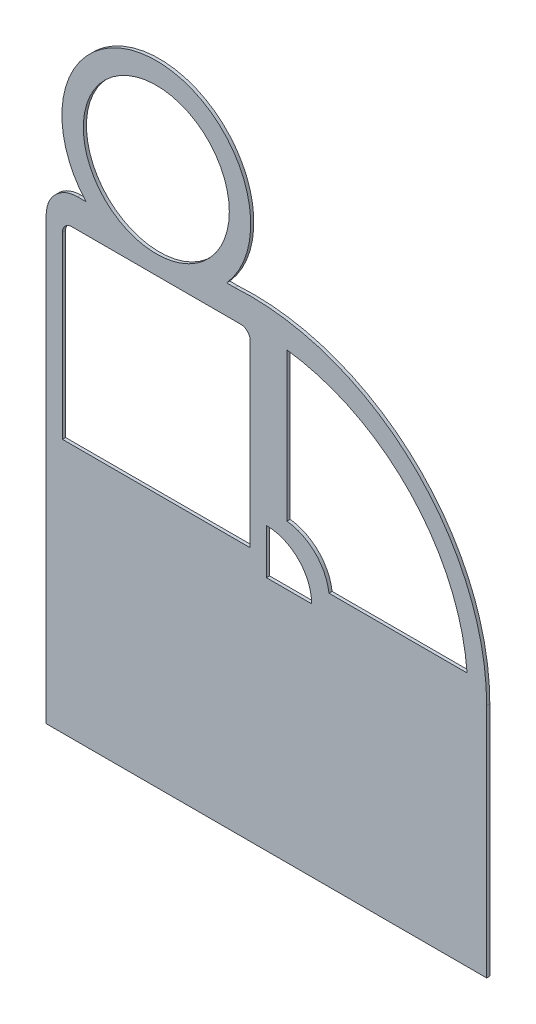
ISO-10303-21;
HEADER;
FILE_DESCRIPTION(('STEP AP214'),'2;1');
FILE_NAME('part.step','',(''),(''),'','','');
FILE_SCHEMA(('AUTOMOTIVE_DESIGN { 1 0 10303 214 1 1 1 1 }'));
ENDSEC;
DATA;
#1=APPLICATION_CONTEXT('core data for automotive mechanical design processes');
#2=APPLICATION_PROTOCOL_DEFINITION('international standard','automotive_design',2000,#1);
#3=PRODUCT_CONTEXT('',#1,'mechanical');
#4=PRODUCT('Part','Part','',(#3));
#5=PRODUCT_RELATED_PRODUCT_CATEGORY('part','',(#4));
#6=PRODUCT_DEFINITION_FORMATION('','',#4);
#7=PRODUCT_DEFINITION_CONTEXT('part definition',#1,'design');
#8=PRODUCT_DEFINITION('design','',#6,#7);
#9=PRODUCT_DEFINITION_SHAPE('','',#8);
#10=(LENGTH_UNIT() NAMED_UNIT(*) SI_UNIT(.MILLI.,.METRE.));
#11=(NAMED_UNIT(*) PLANE_ANGLE_UNIT() SI_UNIT($,.RADIAN.));
#12=(NAMED_UNIT(*) SI_UNIT($,.STERADIAN.) SOLID_ANGLE_UNIT());
#13=UNCERTAINTY_MEASURE_WITH_UNIT(LENGTH_MEASURE(1.E-05),#10,'distance_accuracy_value','');
#14=(GEOMETRIC_REPRESENTATION_CONTEXT(3) GLOBAL_UNCERTAINTY_ASSIGNED_CONTEXT((#13)) GLOBAL_UNIT_ASSIGNED_CONTEXT((#10,
#11,#12)) REPRESENTATION_CONTEXT('',''));
#15=CARTESIAN_POINT('',(0.,0.,0.));
#16=DIRECTION('',(0.,0.,1.));
#17=DIRECTION('',(1.,0.,0.));
#18=AXIS2_PLACEMENT_3D('',#15,#16,#17);
#19=CARTESIAN_POINT('',(0.,-603.714224790879,-10.));
#20=DIRECTION('',(0.,-1.,0.));
#21=DIRECTION('',(0.,0.,-1.));
#22=AXIS2_PLACEMENT_3D('',#19,#20,#21);
#23=PLANE('',#22);
#24=DIRECTION('',(1.,0.,0.));
#25=VECTOR('',#24,1.);
#26=CARTESIAN_POINT('',(0.,-603.714224790879,0.));
#27=LINE('',#26,#25);
#28=CARTESIAN_POINT('',(328.257173598163,-603.714224790879,0.));
#29=VERTEX_POINT('',#28);
#30=CARTESIAN_POINT('',(864.880365348647,-603.714224790879,0.));
#31=VERTEX_POINT('',#30);
#32=EDGE_CURVE('E298',#29,#31,#27,.T.);
#33=ORIENTED_EDGE('',*,*,#32,.F.);
#34=DIRECTION('',(0.,0.,1.));
#35=VECTOR('',#34,1.);
#36=CARTESIAN_POINT('',(328.257173598163,-603.714224790879,-10.));
#37=LINE('',#36,#35);
#38=CARTESIAN_POINT('',(328.257173598163,-603.714224790879,-10.));
#39=VERTEX_POINT('',#38);
#40=EDGE_CURVE('E11',#39,#29,#37,.T.);
#41=ORIENTED_EDGE('',*,*,#40,.F.);
#42=DIRECTION('',(1.,0.,0.));
#43=VECTOR('',#42,1.);
#44=CARTESIAN_POINT('',(0.,-603.714224790879,-10.));
#45=LINE('',#44,#43);
#46=CARTESIAN_POINT('',(864.880365348647,-603.714224790879,-10.));
#47=VERTEX_POINT('',#46);
#48=EDGE_CURVE('E353',#39,#47,#45,.T.);
#49=ORIENTED_EDGE('',*,*,#48,.T.);
#50=DIRECTION('',(0.,0.,1.));
#51=VECTOR('',#50,1.);
#52=CARTESIAN_POINT('',(864.880365348647,-603.714224790879,-10.));
#53=LINE('',#52,#51);
#54=EDGE_CURVE('E214',#47,#31,#53,.T.);
#55=ORIENTED_EDGE('',*,*,#54,.T.);
#56=EDGE_LOOP('',(#33,#41,#49,#55));
#57=FACE_BOUND('',#56,.T.);
#58=ADVANCED_FACE('F35',(#57),#23,.T.);
#59=CARTESIAN_POINT('',(328.257173598163,-633.714224790879,-10.));
#60=DIRECTION('',(0.,0.,1.));
#61=DIRECTION('',(1.,0.,0.));
#62=AXIS2_PLACEMENT_3D('',#59,#60,#61);
#63=CYLINDRICAL_SURFACE('',#62,30.);
#64=CARTESIAN_POINT('',(328.257173598163,-633.714224790879,0.));
#65=DIRECTION('',(0.,0.,1.));
#66=DIRECTION('',(1.,0.,0.));
#67=AXIS2_PLACEMENT_3D('',#64,#65,#66);
#68=CIRCLE('',#67,30.);
#69=CARTESIAN_POINT('',(298.257173598163,-633.714224790879,0.));
#70=VERTEX_POINT('',#69);
#71=EDGE_CURVE('E310',#29,#70,#68,.T.);
#72=ORIENTED_EDGE('',*,*,#71,.T.);
#73=DIRECTION('',(0.,0.,1.));
#74=VECTOR('',#73,1.);
#75=CARTESIAN_POINT('',(298.257173598163,-633.714224790879,-10.));
#76=LINE('',#75,#74);
#77=CARTESIAN_POINT('',(298.257173598163,-633.714224790879,-10.));
#78=VERTEX_POINT('',#77);
#79=EDGE_CURVE('E45',#78,#70,#76,.T.);
#80=ORIENTED_EDGE('',*,*,#79,.F.);
#81=CARTESIAN_POINT('',(328.257173598163,-633.714224790879,-10.));
#82=DIRECTION('',(0.,0.,1.));
#83=DIRECTION('',(1.,0.,0.));
#84=AXIS2_PLACEMENT_3D('',#81,#82,#83);
#85=CIRCLE('',#84,30.);
#86=EDGE_CURVE('E203',#39,#78,#85,.T.);
#87=ORIENTED_EDGE('',*,*,#86,.F.);
#88=ORIENTED_EDGE('',*,*,#40,.T.);
#89=EDGE_LOOP('',(#72,#80,#87,#88));
#90=FACE_BOUND('',#89,.T.);
#91=ADVANCED_FACE('F376',(#90),#63,.F.);
#92=CARTESIAN_POINT('',(298.257173598162,0.,-10.));
#93=DIRECTION('',(-1.,0.,0.));
#94=DIRECTION('',(0.,-1.,0.));
#95=AXIS2_PLACEMENT_3D('',#92,#93,#94);
#96=PLANE('',#95);
#97=DIRECTION('',(0.,-1.,0.));
#98=VECTOR('',#97,1.);
#99=CARTESIAN_POINT('',(298.257173598162,0.,0.));
#100=LINE('',#99,#98);
#101=CARTESIAN_POINT('',(298.257173598163,-1203.71422479088,0.));
#102=VERTEX_POINT('',#101);
#103=EDGE_CURVE('E120',#70,#102,#100,.T.);
#104=ORIENTED_EDGE('',*,*,#103,.T.);
#105=DIRECTION('',(0.,0.,1.));
#106=VECTOR('',#105,1.);
#107=CARTESIAN_POINT('',(298.257173598163,-1203.71422479088,-10.));
#108=LINE('',#107,#106);
#109=CARTESIAN_POINT('',(298.257173598163,-1203.71422479088,-10.));
#110=VERTEX_POINT('',#109);
#111=EDGE_CURVE('E192',#110,#102,#108,.T.);
#112=ORIENTED_EDGE('',*,*,#111,.F.);
#113=DIRECTION('',(0.,-1.,0.));
#114=VECTOR('',#113,1.);
#115=CARTESIAN_POINT('',(298.257173598162,0.,-10.));
#116=LINE('',#115,#114);
#117=EDGE_CURVE('E197',#78,#110,#116,.T.);
#118=ORIENTED_EDGE('',*,*,#117,.F.);
#119=ORIENTED_EDGE('',*,*,#79,.T.);
#120=EDGE_LOOP('',(#104,#112,#118,#119));
#121=FACE_BOUND('',#120,.T.);
#122=ADVANCED_FACE('F207',(#121),#96,.F.);
#123=CARTESIAN_POINT('',(0.,-1203.71422479088,-10.));
#124=DIRECTION('',(0.,-1.,0.));
#125=DIRECTION('',(0.,0.,-1.));
#126=AXIS2_PLACEMENT_3D('',#123,#124,#125);
#127=PLANE('',#126);
#128=DIRECTION('',(1.,0.,0.));
#129=VECTOR('',#128,1.);
#130=CARTESIAN_POINT('',(0.,-1203.71422479088,0.));
#131=LINE('',#130,#129);
#132=CARTESIAN_POINT('',(894.880365348647,-1203.71422479088,0.));
#133=VERTEX_POINT('',#132);
#134=EDGE_CURVE('E307',#102,#133,#131,.T.);
#135=ORIENTED_EDGE('',*,*,#134,.T.);
#136=DIRECTION('',(0.,0.,1.));
#137=VECTOR('',#136,1.);
#138=CARTESIAN_POINT('',(894.880365348647,-1203.71422479088,-10.));
#139=LINE('',#138,#137);
#140=CARTESIAN_POINT('',(894.880365348647,-1203.71422479088,-10.));
#141=VERTEX_POINT('',#140);
#142=EDGE_CURVE('E193',#141,#133,#139,.T.);
#143=ORIENTED_EDGE('',*,*,#142,.F.);
#144=DIRECTION('',(1.,0.,0.));
#145=VECTOR('',#144,1.);
#146=CARTESIAN_POINT('',(0.,-1203.71422479088,-10.));
#147=LINE('',#146,#145);
#148=EDGE_CURVE('E187',#110,#141,#147,.T.);
#149=ORIENTED_EDGE('',*,*,#148,.F.);
#150=ORIENTED_EDGE('',*,*,#111,.T.);
#151=EDGE_LOOP('',(#135,#143,#149,#150));
#152=FACE_BOUND('',#151,.T.);
#153=ADVANCED_FACE('F190',(#152),#127,.F.);
#154=CARTESIAN_POINT('',(894.880365348646,3.48602381015803E-13,-10.));
#155=DIRECTION('',(-1.,0.,0.));
#156=DIRECTION('',(0.,-1.,0.));
#157=AXIS2_PLACEMENT_3D('',#154,#155,#156);
#158=PLANE('',#157);
#159=DIRECTION('',(0.,-1.,0.));
#160=VECTOR('',#159,1.);
#161=CARTESIAN_POINT('',(894.880365348646,3.48602381015803E-13,0.));
#162=LINE('',#161,#160);
#163=CARTESIAN_POINT('',(894.880365348647,-633.714224790879,0.));
#164=VERTEX_POINT('',#163);
#165=EDGE_CURVE('E304',#164,#133,#162,.T.);
#166=ORIENTED_EDGE('',*,*,#165,.F.);
#167=DIRECTION('',(0.,0.,1.));
#168=VECTOR('',#167,1.);
#169=CARTESIAN_POINT('',(894.880365348647,-633.714224790879,-10.));
#170=LINE('',#169,#168);
#171=CARTESIAN_POINT('',(894.880365348647,-633.714224790879,-10.));
#172=VERTEX_POINT('',#171);
#173=EDGE_CURVE('E210',#172,#164,#170,.T.);
#174=ORIENTED_EDGE('',*,*,#173,.F.);
#175=DIRECTION('',(0.,-1.,0.));
#176=VECTOR('',#175,1.);
#177=CARTESIAN_POINT('',(894.880365348646,3.48602381015803E-13,-10.));
#178=LINE('',#177,#176);
#179=EDGE_CURVE('E198',#172,#141,#178,.T.);
#180=ORIENTED_EDGE('',*,*,#179,.T.);
#181=ORIENTED_EDGE('',*,*,#142,.T.);
#182=EDGE_LOOP('',(#166,#174,#180,#181));
#183=FACE_BOUND('',#182,.T.);
#184=ADVANCED_FACE('F360',(#183),#158,.T.);
#185=CARTESIAN_POINT('',(894.880365348647,-1262.2429395449,-10.));
#186=DIRECTION('',(0.,0.,1.));
#187=DIRECTION('',(1.,0.,0.));
#188=AXIS2_PLACEMENT_3D('',#185,#186,#187);
#189=CYLINDRICAL_SURFACE('',#188,751.688404124758);
#190=CARTESIAN_POINT('',(894.880365348647,-1262.2429395449,0.));
#191=DIRECTION('',(0.,0.,1.));
#192=DIRECTION('',(1.,0.,0.));
#193=AXIS2_PLACEMENT_3D('',#190,#191,#192);
#194=CIRCLE('',#193,751.688404124758);
#195=CARTESIAN_POINT('',(846.568769473404,-512.108653833588,0.));
#196=VERTEX_POINT('',#195);
#197=CARTESIAN_POINT('',(1646.56876947341,-1262.2429395449,0.));
#198=VERTEX_POINT('',#197);
#199=EDGE_CURVE('E275',#196,#198,#194,.F.);
#200=ORIENTED_EDGE('',*,*,#199,.T.);
#201=DIRECTION('',(0.,0.,1.));
#202=VECTOR('',#201,1.);
#203=CARTESIAN_POINT('',(1646.56876947341,-1262.2429395449,-10.));
#204=LINE('',#203,#202);
#205=CARTESIAN_POINT('',(1646.56876947341,-1262.2429395449,-10.));
#206=VERTEX_POINT('',#205);
#207=EDGE_CURVE('E216',#206,#198,#204,.T.);
#208=ORIENTED_EDGE('',*,*,#207,.F.);
#209=CARTESIAN_POINT('',(894.880365348647,-1262.2429395449,-10.));
#210=DIRECTION('',(0.,0.,1.));
#211=DIRECTION('',(1.,0.,0.));
#212=AXIS2_PLACEMENT_3D('',#209,#210,#211);
#213=CIRCLE('',#212,751.688404124758);
#214=CARTESIAN_POINT('',(846.568769473404,-512.108653833588,-10.));
#215=VERTEX_POINT('',#214);
#216=EDGE_CURVE('E332',#215,#206,#213,.F.);
#217=ORIENTED_EDGE('',*,*,#216,.F.);
#218=DIRECTION('',(0.,0.,1.));
#219=VECTOR('',#218,1.);
#220=CARTESIAN_POINT('',(846.568769473404,-512.108653833588,-10.));
#221=LINE('',#220,#219);
#222=EDGE_CURVE('E230',#215,#196,#221,.T.);
#223=ORIENTED_EDGE('',*,*,#222,.T.);
#224=EDGE_LOOP('',(#200,#208,#217,#223));
#225=FACE_BOUND('',#224,.T.);
#226=ADVANCED_FACE('F388',(#225),#189,.T.);
#227=CARTESIAN_POINT('',(1646.56876947341,0.,-10.));
#228=DIRECTION('',(1.,0.,0.));
#229=DIRECTION('',(0.,0.,-1.));
#230=AXIS2_PLACEMENT_3D('',#227,#228,#229);
#231=PLANE('',#230);
#232=DIRECTION('',(0.,1.,0.));
#233=VECTOR('',#232,1.);
#234=CARTESIAN_POINT('',(1646.56876947341,0.,0.));
#235=LINE('',#234,#233);
#236=CARTESIAN_POINT('',(1646.56876947341,-2012.2429395449,0.));
#237=VERTEX_POINT('',#236);
#238=EDGE_CURVE('E295',#237,#198,#235,.T.);
#239=ORIENTED_EDGE('',*,*,#238,.F.);
#240=DIRECTION('',(0.,0.,1.));
#241=VECTOR('',#240,1.);
#242=CARTESIAN_POINT('',(1646.56876947341,-2012.2429395449,-10.));
#243=LINE('',#242,#241);
#244=CARTESIAN_POINT('',(1646.56876947341,-2012.2429395449,-10.));
#245=VERTEX_POINT('',#244);
#246=EDGE_CURVE('E218',#245,#237,#243,.T.);
#247=ORIENTED_EDGE('',*,*,#246,.F.);
#248=DIRECTION('',(0.,1.,0.));
#249=VECTOR('',#248,1.);
#250=CARTESIAN_POINT('',(1646.56876947341,0.,-10.));
#251=LINE('',#250,#249);
#252=EDGE_CURVE('E350',#245,#206,#251,.T.);
#253=ORIENTED_EDGE('',*,*,#252,.T.);
#254=ORIENTED_EDGE('',*,*,#207,.T.);
#255=EDGE_LOOP('',(#239,#247,#253,#254));
#256=FACE_BOUND('',#255,.T.);
#257=ADVANCED_FACE('F384',(#256),#231,.T.);
#258=CARTESIAN_POINT('',(0.,-2012.2429395449,-10.));
#259=DIRECTION('',(0.,-1.,0.));
#260=DIRECTION('',(0.,0.,-1.));
#261=AXIS2_PLACEMENT_3D('',#258,#259,#260);
#262=PLANE('',#261);
#263=DIRECTION('',(1.,0.,0.));
#264=VECTOR('',#263,1.);
#265=CARTESIAN_POINT('',(0.,-2012.2429395449,0.));
#266=LINE('',#265,#264);
#267=CARTESIAN_POINT('',(246.568769473405,-2012.2429395449,0.));
#268=VERTEX_POINT('',#267);
#269=EDGE_CURVE('E292',#268,#237,#266,.T.);
#270=ORIENTED_EDGE('',*,*,#269,.F.);
#271=DIRECTION('',(0.,0.,1.));
#272=VECTOR('',#271,1.);
#273=CARTESIAN_POINT('',(246.568769473405,-2012.2429395449,-10.));
#274=LINE('',#273,#272);
#275=CARTESIAN_POINT('',(246.568769473405,-2012.2429395449,-10.));
#276=VERTEX_POINT('',#275);
#277=EDGE_CURVE('E220',#276,#268,#274,.T.);
#278=ORIENTED_EDGE('',*,*,#277,.F.);
#279=DIRECTION('',(1.,0.,0.));
#280=VECTOR('',#279,1.);
#281=CARTESIAN_POINT('',(0.,-2012.2429395449,-10.));
#282=LINE('',#281,#280);
#283=EDGE_CURVE('E347',#276,#245,#282,.T.);
#284=ORIENTED_EDGE('',*,*,#283,.T.);
#285=ORIENTED_EDGE('',*,*,#246,.T.);
#286=EDGE_LOOP('',(#270,#278,#284,#285));
#287=FACE_BOUND('',#286,.T.);
#288=ADVANCED_FACE('F387',(#287),#262,.T.);
#289=CARTESIAN_POINT('',(246.568769473405,0.,-10.));
#290=DIRECTION('',(-1.,0.,0.));
#291=DIRECTION('',(0.,-1.,0.));
#292=AXIS2_PLACEMENT_3D('',#289,#290,#291);
#293=PLANE('',#292);
#294=DIRECTION('',(0.,-1.,0.));
#295=VECTOR('',#294,1.);
#296=CARTESIAN_POINT('',(246.568769473405,0.,0.));
#297=LINE('',#296,#295);
#298=CARTESIAN_POINT('',(246.568769473405,-612.108653833588,0.));
#299=VERTEX_POINT('',#298);
#300=EDGE_CURVE('E289',#299,#268,#297,.T.);
#301=ORIENTED_EDGE('',*,*,#300,.F.);
#302=DIRECTION('',(0.,0.,1.));
#303=VECTOR('',#302,1.);
#304=CARTESIAN_POINT('',(246.568769473405,-612.108653833588,-10.));
#305=LINE('',#304,#303);
#306=CARTESIAN_POINT('',(246.568769473405,-612.108653833588,-10.));
#307=VERTEX_POINT('',#306);
#308=EDGE_CURVE('E222',#307,#299,#305,.T.);
#309=ORIENTED_EDGE('',*,*,#308,.F.);
#310=DIRECTION('',(0.,-1.,0.));
#311=VECTOR('',#310,1.);
#312=CARTESIAN_POINT('',(246.568769473405,0.,-10.));
#313=LINE('',#312,#311);
#314=EDGE_CURVE('E344',#307,#276,#313,.T.);
#315=ORIENTED_EDGE('',*,*,#314,.T.);
#316=ORIENTED_EDGE('',*,*,#277,.T.);
#317=EDGE_LOOP('',(#301,#309,#315,#316));
#318=FACE_BOUND('',#317,.T.);
#319=ADVANCED_FACE('F392',(#318),#293,.T.);
#320=CARTESIAN_POINT('',(346.568769473405,-612.108653833588,-10.));
#321=DIRECTION('',(0.,0.,1.));
#322=DIRECTION('',(1.,0.,0.));
#323=AXIS2_PLACEMENT_3D('',#320,#321,#322);
#324=CYLINDRICAL_SURFACE('',#323,100.);
#325=CARTESIAN_POINT('',(346.568769473405,-612.108653833588,0.));
#326=DIRECTION('',(0.,0.,1.));
#327=DIRECTION('',(1.,0.,0.));
#328=AXIS2_PLACEMENT_3D('',#325,#326,#327);
#329=CIRCLE('',#328,100.);
#330=CARTESIAN_POINT('',(346.568769473405,-512.108653833588,0.));
#331=VERTEX_POINT('',#330);
#332=EDGE_CURVE('E286',#331,#299,#329,.T.);
#333=ORIENTED_EDGE('',*,*,#332,.F.);
#334=DIRECTION('',(0.,0.,1.));
#335=VECTOR('',#334,1.);
#336=CARTESIAN_POINT('',(346.568769473405,-512.108653833588,-10.));
#337=LINE('',#336,#335);
#338=CARTESIAN_POINT('',(346.568769473405,-512.108653833588,-10.));
#339=VERTEX_POINT('',#338);
#340=EDGE_CURVE('E224',#339,#331,#337,.T.);
#341=ORIENTED_EDGE('',*,*,#340,.F.);
#342=CARTESIAN_POINT('',(346.568769473405,-612.108653833588,-10.));
#343=DIRECTION('',(0.,0.,1.));
#344=DIRECTION('',(1.,0.,0.));
#345=AXIS2_PLACEMENT_3D('',#342,#343,#344);
#346=CIRCLE('',#345,100.);
#347=EDGE_CURVE('E341',#339,#307,#346,.T.);
#348=ORIENTED_EDGE('',*,*,#347,.T.);
#349=ORIENTED_EDGE('',*,*,#308,.T.);
#350=EDGE_LOOP('',(#333,#341,#348,#349));
#351=FACE_BOUND('',#350,.T.);
#352=ADVANCED_FACE('F396',(#351),#324,.T.);
#353=CARTESIAN_POINT('',(-4.3083428316879E-12,-512.108653833585,-10.));
#354=DIRECTION('',(0.,-1.,0.));
#355=DIRECTION('',(1.,0.,0.));
#356=AXIS2_PLACEMENT_3D('',#353,#354,#355);
#357=PLANE('',#356);
#358=DIRECTION('',(1.,0.,0.));
#359=VECTOR('',#358,1.);
#360=CARTESIAN_POINT('',(-4.3083428316879E-12,-512.108653833585,0.));
#361=LINE('',#360,#359);
#362=CARTESIAN_POINT('',(372.961971723426,-512.108653833588,0.));
#363=VERTEX_POINT('',#362);
#364=EDGE_CURVE('E283',#331,#363,#361,.T.);
#365=ORIENTED_EDGE('',*,*,#364,.T.);
#366=DIRECTION('',(0.,0.,1.));
#367=VECTOR('',#366,1.);
#368=CARTESIAN_POINT('',(372.961971723426,-512.108653833588,-10.));
#369=LINE('',#368,#367);
#370=CARTESIAN_POINT('',(372.961971723426,-512.108653833588,-10.));
#371=VERTEX_POINT('',#370);
#372=EDGE_CURVE('E226',#371,#363,#369,.T.);
#373=ORIENTED_EDGE('',*,*,#372,.F.);
#374=DIRECTION('',(1.,0.,0.));
#375=VECTOR('',#374,1.);
#376=CARTESIAN_POINT('',(-4.3083428316879E-12,-512.108653833585,-10.));
#377=LINE('',#376,#375);
#378=EDGE_CURVE('E339',#339,#371,#377,.T.);
#379=ORIENTED_EDGE('',*,*,#378,.F.);
#380=ORIENTED_EDGE('',*,*,#340,.T.);
#381=EDGE_LOOP('',(#365,#373,#379,#380));
#382=FACE_BOUND('',#381,.T.);
#383=ADVANCED_FACE('F400',(#382),#357,.F.);
#384=CARTESIAN_POINT('',(596.568769473405,-312.108653833588,-10.));
#385=DIRECTION('',(0.,0.,1.));
#386=DIRECTION('',(1.,0.,0.));
#387=AXIS2_PLACEMENT_3D('',#384,#385,#386);
#388=CYLINDRICAL_SURFACE('',#387,300.);
#389=CARTESIAN_POINT('',(596.568769473405,-312.108653833588,0.));
#390=DIRECTION('',(0.,0.,1.));
#391=DIRECTION('',(1.,0.,0.));
#392=AXIS2_PLACEMENT_3D('',#389,#390,#391);
#393=CIRCLE('',#392,300.);
#394=CARTESIAN_POINT('',(820.175567223384,-512.108653833588,0.));
#395=VERTEX_POINT('',#394);
#396=EDGE_CURVE('E280',#395,#363,#393,.T.);
#397=ORIENTED_EDGE('',*,*,#396,.F.);
#398=DIRECTION('',(0.,0.,1.));
#399=VECTOR('',#398,1.);
#400=CARTESIAN_POINT('',(820.175567223384,-512.108653833588,-10.));
#401=LINE('',#400,#399);
#402=CARTESIAN_POINT('',(820.175567223384,-512.108653833588,-10.));
#403=VERTEX_POINT('',#402);
#404=EDGE_CURVE('E228',#403,#395,#401,.T.);
#405=ORIENTED_EDGE('',*,*,#404,.F.);
#406=CARTESIAN_POINT('',(596.568769473405,-312.108653833588,-10.));
#407=DIRECTION('',(0.,0.,1.));
#408=DIRECTION('',(1.,0.,0.));
#409=AXIS2_PLACEMENT_3D('',#406,#407,#408);
#410=CIRCLE('',#409,300.);
#411=EDGE_CURVE('E336',#403,#371,#410,.T.);
#412=ORIENTED_EDGE('',*,*,#411,.T.);
#413=ORIENTED_EDGE('',*,*,#372,.T.);
#414=EDGE_LOOP('',(#397,#405,#412,#413));
#415=FACE_BOUND('',#414,.T.);
#416=ADVANCED_FACE('F404',(#415),#388,.T.);
#417=CARTESIAN_POINT('',(994.844672827467,-1222.83086467916,-10.));
#418=DIRECTION('',(0.,0.,1.));
#419=DIRECTION('',(1.,0.,0.));
#420=AXIS2_PLACEMENT_3D('',#417,#418,#419);
#421=CYLINDRICAL_SURFACE('',#420,151.742480539189);
#422=CARTESIAN_POINT('',(994.844672827467,-1222.83086467916,0.));
#423=DIRECTION('',(0.,0.,1.));
#424=DIRECTION('',(1.,0.,0.));
#425=AXIS2_PLACEMENT_3D('',#422,#423,#424);
#426=CIRCLE('',#425,151.742480539189);
#427=CARTESIAN_POINT('',(1012.06500998814,-1072.06866653831,0.));
#428=VERTEX_POINT('',#427);
#429=CARTESIAN_POINT('',(1145.37817235355,-1203.71422479088,0.));
#430=VERTEX_POINT('',#429);
#431=EDGE_CURVE('E261',#428,#430,#426,.F.);
#432=ORIENTED_EDGE('',*,*,#431,.T.);
#433=DIRECTION('',(0.,0.,1.));
#434=VECTOR('',#433,1.);
#435=CARTESIAN_POINT('',(1145.37817235355,-1203.71422479088,-10.));
#436=LINE('',#435,#434);
#437=CARTESIAN_POINT('',(1145.37817235355,-1203.71422479088,-10.));
#438=VERTEX_POINT('',#437);
#439=EDGE_CURVE('E233',#438,#430,#436,.T.);
#440=ORIENTED_EDGE('',*,*,#439,.F.);
#441=CARTESIAN_POINT('',(994.844672827467,-1222.83086467916,-10.));
#442=DIRECTION('',(0.,0.,1.));
#443=DIRECTION('',(1.,0.,0.));
#444=AXIS2_PLACEMENT_3D('',#441,#442,#443);
#445=CIRCLE('',#444,151.742480539189);
#446=CARTESIAN_POINT('',(1012.06500998814,-1072.06866653831,-10.));
#447=VERTEX_POINT('',#446);
#448=EDGE_CURVE('E319',#447,#438,#445,.F.);
#449=ORIENTED_EDGE('',*,*,#448,.F.);
#450=DIRECTION('',(0.,0.,1.));
#451=VECTOR('',#450,1.);
#452=CARTESIAN_POINT('',(1012.06500998814,-1072.06866653831,-10.));
#453=LINE('',#452,#451);
#454=EDGE_CURVE('E240',#447,#428,#453,.T.);
#455=ORIENTED_EDGE('',*,*,#454,.T.);
#456=EDGE_LOOP('',(#432,#440,#449,#455));
#457=FACE_BOUND('',#456,.T.);
#458=ADVANCED_FACE('F408',(#457),#421,.T.);
#459=CARTESIAN_POINT('',(0.,-1203.71422479088,-10.));
#460=DIRECTION('',(0.,-1.,0.));
#461=DIRECTION('',(0.,0.,-1.));
#462=AXIS2_PLACEMENT_3D('',#459,#460,#461);
#463=PLANE('',#462);
#464=DIRECTION('',(1.,0.,0.));
#465=VECTOR('',#464,1.);
#466=CARTESIAN_POINT('',(0.,-1203.71422479088,0.));
#467=LINE('',#466,#465);
#468=CARTESIAN_POINT('',(1584.26307766888,-1203.71422479088,0.));
#469=VERTEX_POINT('',#468);
#470=EDGE_CURVE('E269',#430,#469,#467,.T.);
#471=ORIENTED_EDGE('',*,*,#470,.T.);
#472=DIRECTION('',(0.,0.,1.));
#473=VECTOR('',#472,1.);
#474=CARTESIAN_POINT('',(1584.26307766888,-1203.71422479088,-10.));
#475=LINE('',#474,#473);
#476=CARTESIAN_POINT('',(1584.26307766888,-1203.71422479088,-10.));
#477=VERTEX_POINT('',#476);
#478=EDGE_CURVE('E236',#477,#469,#475,.T.);
#479=ORIENTED_EDGE('',*,*,#478,.F.);
#480=DIRECTION('',(1.,0.,0.));
#481=VECTOR('',#480,1.);
#482=CARTESIAN_POINT('',(0.,-1203.71422479088,-10.));
#483=LINE('',#482,#481);
#484=EDGE_CURVE('E327',#438,#477,#483,.T.);
#485=ORIENTED_EDGE('',*,*,#484,.F.);
#486=ORIENTED_EDGE('',*,*,#439,.T.);
#487=EDGE_LOOP('',(#471,#479,#485,#486));
#488=FACE_BOUND('',#487,.T.);
#489=ADVANCED_FACE('F423',(#488),#463,.F.);
#490=CARTESIAN_POINT('',(927.837910491608,-1253.78422421776,-10.));
#491=DIRECTION('',(0.,0.,1.));
#492=DIRECTION('',(1.,0.,0.));
#493=AXIS2_PLACEMENT_3D('',#490,#491,#492);
#494=CYLINDRICAL_SURFACE('',#493,658.331986877682);
#495=CARTESIAN_POINT('',(927.837910491608,-1253.78422421776,0.));
#496=DIRECTION('',(0.,0.,1.));
#497=DIRECTION('',(1.,0.,0.));
#498=AXIS2_PLACEMENT_3D('',#495,#496,#497);
#499=CIRCLE('',#498,658.331986877682);
#500=CARTESIAN_POINT('',(1012.06500998814,-600.862482615661,0.));
#501=VERTEX_POINT('',#500);
#502=EDGE_CURVE('E266',#501,#469,#499,.F.);
#503=ORIENTED_EDGE('',*,*,#502,.F.);
#504=DIRECTION('',(0.,0.,1.));
#505=VECTOR('',#504,1.);
#506=CARTESIAN_POINT('',(1012.06500998814,-600.862482615661,-10.));
#507=LINE('',#506,#505);
#508=CARTESIAN_POINT('',(1012.06500998814,-600.862482615661,-10.));
#509=VERTEX_POINT('',#508);
#510=EDGE_CURVE('E238',#509,#501,#507,.T.);
#511=ORIENTED_EDGE('',*,*,#510,.F.);
#512=CARTESIAN_POINT('',(927.837910491608,-1253.78422421776,-10.));
#513=DIRECTION('',(0.,0.,1.));
#514=DIRECTION('',(1.,0.,0.));
#515=AXIS2_PLACEMENT_3D('',#512,#513,#514);
#516=CIRCLE('',#515,658.331986877682);
#517=EDGE_CURVE('E324',#509,#477,#516,.F.);
#518=ORIENTED_EDGE('',*,*,#517,.T.);
#519=ORIENTED_EDGE('',*,*,#478,.T.);
#520=EDGE_LOOP('',(#503,#511,#518,#519));
#521=FACE_BOUND('',#520,.T.);
#522=ADVANCED_FACE('F426',(#521),#494,.F.);
#523=CARTESIAN_POINT('',(946.568769473404,1.61643904245212E-13,-10.));
#524=DIRECTION('',(-1.,0.,0.));
#525=DIRECTION('',(0.,-1.,0.));
#526=AXIS2_PLACEMENT_3D('',#523,#524,#525);
#527=PLANE('',#526);
#528=DIRECTION('',(0.,-1.,0.));
#529=VECTOR('',#528,1.);
#530=CARTESIAN_POINT('',(946.568769473404,1.61643904245212E-13,0.));
#531=LINE('',#530,#529);
#532=CARTESIAN_POINT('',(946.568769473404,-1116.80715303282,0.));
#533=VERTEX_POINT('',#532);
#534=CARTESIAN_POINT('',(946.568769473404,-1260.41644017847,0.));
#535=VERTEX_POINT('',#534);
#536=EDGE_CURVE('E254',#533,#535,#531,.T.);
#537=ORIENTED_EDGE('',*,*,#536,.T.);
#538=DIRECTION('',(0.,0.,1.));
#539=VECTOR('',#538,1.);
#540=CARTESIAN_POINT('',(946.568769473404,-1260.41644017847,-10.));
#541=LINE('',#540,#539);
#542=CARTESIAN_POINT('',(946.568769473404,-1260.41644017847,-10.));
#543=VERTEX_POINT('',#542);
#544=EDGE_CURVE('E243',#543,#535,#541,.T.);
#545=ORIENTED_EDGE('',*,*,#544,.F.);
#546=DIRECTION('',(0.,-1.,0.));
#547=VECTOR('',#546,1.);
#548=CARTESIAN_POINT('',(946.568769473404,1.61643904245212E-13,-10.));
#549=LINE('',#548,#547);
#550=CARTESIAN_POINT('',(946.568769473404,-1116.80715303282,-10.));
#551=VERTEX_POINT('',#550);
#552=EDGE_CURVE('E311',#551,#543,#549,.T.);
#553=ORIENTED_EDGE('',*,*,#552,.F.);
#554=DIRECTION('',(0.,0.,1.));
#555=VECTOR('',#554,1.);
#556=CARTESIAN_POINT('',(946.568769473404,-1116.80715303282,-10.));
#557=LINE('',#556,#555);
#558=EDGE_CURVE('E39',#551,#533,#557,.T.);
#559=ORIENTED_EDGE('',*,*,#558,.T.);
#560=EDGE_LOOP('',(#537,#545,#553,#559));
#561=FACE_BOUND('',#560,.T.);
#562=ADVANCED_FACE('F37',(#561),#527,.F.);
#563=CARTESIAN_POINT('',(0.,-1260.41644017847,-10.));
#564=DIRECTION('',(0.,1.,0.));
#565=DIRECTION('',(0.,0.,1.));
#566=AXIS2_PLACEMENT_3D('',#563,#564,#565);
#567=PLANE('',#566);
#568=DIRECTION('',(-1.,0.,0.));
#569=VECTOR('',#568,1.);
#570=CARTESIAN_POINT('',(0.,-1260.41644017847,0.));
#571=LINE('',#570,#569);
#572=CARTESIAN_POINT('',(1090.17805661906,-1260.41644017847,0.));
#573=VERTEX_POINT('',#572);
#574=EDGE_CURVE('E258',#573,#535,#571,.T.);
#575=ORIENTED_EDGE('',*,*,#574,.F.);
#576=DIRECTION('',(0.,0.,1.));
#577=VECTOR('',#576,1.);
#578=CARTESIAN_POINT('',(1090.17805661906,-1260.41644017847,-10.));
#579=LINE('',#578,#577);
#580=CARTESIAN_POINT('',(1090.17805661906,-1260.41644017847,-10.));
#581=VERTEX_POINT('',#580);
#582=EDGE_CURVE('E244',#581,#573,#579,.T.);
#583=ORIENTED_EDGE('',*,*,#582,.F.);
#584=DIRECTION('',(-1.,0.,0.));
#585=VECTOR('',#584,1.);
#586=CARTESIAN_POINT('',(0.,-1260.41644017847,-10.));
#587=LINE('',#586,#585);
#588=EDGE_CURVE('E314',#581,#543,#587,.T.);
#589=ORIENTED_EDGE('',*,*,#588,.T.);
#590=ORIENTED_EDGE('',*,*,#544,.T.);
#591=EDGE_LOOP('',(#575,#583,#589,#590));
#592=FACE_BOUND('',#591,.T.);
#593=ADVANCED_FACE('F414',(#592),#567,.T.);
#594=CARTESIAN_POINT('',(0.,-512.108653833588,-10.));
#595=DIRECTION('',(0.,-1.,0.));
#596=DIRECTION('',(0.,0.,-1.));
#597=AXIS2_PLACEMENT_3D('',#594,#595,#596);
#598=PLANE('',#597);
#599=DIRECTION('',(1.,0.,0.));
#600=VECTOR('',#599,1.);
#601=CARTESIAN_POINT('',(0.,-512.108653833588,0.));
#602=LINE('',#601,#600);
#603=EDGE_CURVE('E278',#395,#196,#602,.T.);
#604=ORIENTED_EDGE('',*,*,#603,.T.);
#605=ORIENTED_EDGE('',*,*,#222,.F.);
#606=DIRECTION('',(1.,0.,0.));
#607=VECTOR('',#606,1.);
#608=CARTESIAN_POINT('',(0.,-512.108653833588,-10.));
#609=LINE('',#608,#607);
#610=EDGE_CURVE('E334',#403,#215,#609,.T.);
#611=ORIENTED_EDGE('',*,*,#610,.F.);
#612=ORIENTED_EDGE('',*,*,#404,.T.);
#613=EDGE_LOOP('',(#604,#605,#611,#612));
#614=FACE_BOUND('',#613,.T.);
#615=ADVANCED_FACE('F410',(#614),#598,.F.);
#616=CARTESIAN_POINT('',(596.568769473405,-312.108653833588,-10.));
#617=DIRECTION('',(0.,0.,1.));
#618=DIRECTION('',(1.,0.,0.));
#619=AXIS2_PLACEMENT_3D('',#616,#617,#618);
#620=CYLINDRICAL_SURFACE('',#619,232.012436725503);
#621=CARTESIAN_POINT('',(596.568769473405,-312.108653833588,-10.));
#622=DIRECTION('',(0.,0.,1.));
#623=DIRECTION('',(1.,0.,0.));
#624=AXIS2_PLACEMENT_3D('',#621,#622,#623);
#625=CIRCLE('',#624,232.012436725503);
#626=CARTESIAN_POINT('',(828.581206198908,-312.108653833588,-10.));
#627=VERTEX_POINT('',#626);
#628=EDGE_CURVE('E329',#627,#627,#625,.T.);
#629=ORIENTED_EDGE('',*,*,#628,.F.);
#630=EDGE_LOOP('',(#629));
#631=FACE_BOUND('',#630,.T.);
#632=CARTESIAN_POINT('',(596.568769473405,-312.108653833588,0.));
#633=DIRECTION('',(0.,0.,1.));
#634=DIRECTION('',(1.,0.,0.));
#635=AXIS2_PLACEMENT_3D('',#632,#633,#634);
#636=CIRCLE('',#635,232.012436725503);
#637=CARTESIAN_POINT('',(828.581206198908,-312.108653833588,0.));
#638=VERTEX_POINT('',#637);
#639=EDGE_CURVE('E272',#638,#638,#636,.T.);
#640=ORIENTED_EDGE('',*,*,#639,.T.);
#641=EDGE_LOOP('',(#640));
#642=FACE_BOUND('',#641,.T.);
#643=ADVANCED_FACE('F413',(#631,#642),#620,.F.);
#644=CARTESIAN_POINT('',(1012.06500998814,0.,-10.));
#645=DIRECTION('',(-1.,0.,0.));
#646=DIRECTION('',(0.,0.,1.));
#647=AXIS2_PLACEMENT_3D('',#644,#645,#646);
#648=PLANE('',#647);
#649=DIRECTION('',(0.,-1.,0.));
#650=VECTOR('',#649,1.);
#651=CARTESIAN_POINT('',(1012.06500998814,0.,0.));
#652=LINE('',#651,#650);
#653=EDGE_CURVE('E264',#501,#428,#652,.T.);
#654=ORIENTED_EDGE('',*,*,#653,.T.);
#655=ORIENTED_EDGE('',*,*,#454,.F.);
#656=DIRECTION('',(0.,-1.,0.));
#657=VECTOR('',#656,1.);
#658=CARTESIAN_POINT('',(1012.06500998814,0.,-10.));
#659=LINE('',#658,#657);
#660=EDGE_CURVE('E322',#509,#447,#659,.T.);
#661=ORIENTED_EDGE('',*,*,#660,.F.);
#662=ORIENTED_EDGE('',*,*,#510,.T.);
#663=EDGE_LOOP('',(#654,#655,#661,#662));
#664=FACE_BOUND('',#663,.T.);
#665=ADVANCED_FACE('F421',(#664),#648,.F.);
#666=CARTESIAN_POINT('',(946.568769473404,-1260.41644017847,-10.));
#667=DIRECTION('',(0.,0.,1.));
#668=DIRECTION('',(1.,0.,0.));
#669=AXIS2_PLACEMENT_3D('',#666,#667,#668);
#670=CYLINDRICAL_SURFACE('',#669,143.609287145651);
#671=CARTESIAN_POINT('',(946.568769473404,-1260.41644017847,0.));
#672=DIRECTION('',(0.,0.,1.));
#673=DIRECTION('',(1.,0.,0.));
#674=AXIS2_PLACEMENT_3D('',#671,#672,#673);
#675=CIRCLE('',#674,143.609287145651);
#676=EDGE_CURVE('E256',#573,#533,#675,.T.);
#677=ORIENTED_EDGE('',*,*,#676,.T.);
#678=ORIENTED_EDGE('',*,*,#558,.F.);
#679=CARTESIAN_POINT('',(946.568769473404,-1260.41644017847,-10.));
#680=DIRECTION('',(0.,0.,1.));
#681=DIRECTION('',(1.,0.,0.));
#682=AXIS2_PLACEMENT_3D('',#679,#680,#681);
#683=CIRCLE('',#682,143.609287145651);
#684=EDGE_CURVE('E132',#581,#551,#683,.T.);
#685=ORIENTED_EDGE('',*,*,#684,.F.);
#686=ORIENTED_EDGE('',*,*,#582,.T.);
#687=EDGE_LOOP('',(#677,#678,#685,#686));
#688=FACE_BOUND('',#687,.T.);
#689=ADVANCED_FACE('F433',(#688),#670,.F.);
#690=CARTESIAN_POINT('',(864.880365348647,-633.714224790879,-10.));
#691=DIRECTION('',(0.,0.,1.));
#692=DIRECTION('',(1.,0.,0.));
#693=AXIS2_PLACEMENT_3D('',#690,#691,#692);
#694=CYLINDRICAL_SURFACE('',#693,30.);
#695=CARTESIAN_POINT('',(864.880365348647,-633.714224790879,0.));
#696=DIRECTION('',(0.,0.,1.));
#697=DIRECTION('',(1.,0.,0.));
#698=AXIS2_PLACEMENT_3D('',#695,#696,#697);
#699=CIRCLE('',#698,30.);
#700=EDGE_CURVE('E301',#31,#164,#699,.F.);
#701=ORIENTED_EDGE('',*,*,#700,.F.);
#702=ORIENTED_EDGE('',*,*,#54,.F.);
#703=CARTESIAN_POINT('',(864.880365348647,-633.714224790879,-10.));
#704=DIRECTION('',(0.,0.,1.));
#705=DIRECTION('',(1.,0.,0.));
#706=AXIS2_PLACEMENT_3D('',#703,#704,#705);
#707=CIRCLE('',#706,30.);
#708=EDGE_CURVE('E355',#47,#172,#707,.F.);
#709=ORIENTED_EDGE('',*,*,#708,.T.);
#710=ORIENTED_EDGE('',*,*,#173,.T.);
#711=EDGE_LOOP('',(#701,#702,#709,#710));
#712=FACE_BOUND('',#711,.T.);
#713=ADVANCED_FACE('F364',(#712),#694,.F.);
#714=CARTESIAN_POINT('',(0.,0.,-10.));
#715=DIRECTION('',(0.,0.,1.));
#716=DIRECTION('',(1.,0.,0.));
#717=AXIS2_PLACEMENT_3D('',#714,#715,#716);
#718=PLANE('',#717);
#719=ORIENTED_EDGE('',*,*,#552,.T.);
#720=ORIENTED_EDGE('',*,*,#588,.F.);
#721=ORIENTED_EDGE('',*,*,#684,.T.);
#722=EDGE_LOOP('',(#719,#720,#721));
#723=FACE_BOUND('',#722,.T.);
#724=ORIENTED_EDGE('',*,*,#448,.T.);
#725=ORIENTED_EDGE('',*,*,#484,.T.);
#726=ORIENTED_EDGE('',*,*,#517,.F.);
#727=ORIENTED_EDGE('',*,*,#660,.T.);
#728=EDGE_LOOP('',(#724,#725,#726,#727));
#729=FACE_BOUND('',#728,.T.);
#730=ORIENTED_EDGE('',*,*,#628,.T.);
#731=EDGE_LOOP('',(#730));
#732=FACE_BOUND('',#731,.T.);
#733=ORIENTED_EDGE('',*,*,#216,.T.);
#734=ORIENTED_EDGE('',*,*,#252,.F.);
#735=ORIENTED_EDGE('',*,*,#283,.F.);
#736=ORIENTED_EDGE('',*,*,#314,.F.);
#737=ORIENTED_EDGE('',*,*,#347,.F.);
#738=ORIENTED_EDGE('',*,*,#378,.T.);
#739=ORIENTED_EDGE('',*,*,#411,.F.);
#740=ORIENTED_EDGE('',*,*,#610,.T.);
#741=EDGE_LOOP('',(#733,#734,#735,#736,#737,#738,#739,#740));
#742=FACE_BOUND('',#741,.T.);
#743=ORIENTED_EDGE('',*,*,#48,.F.);
#744=ORIENTED_EDGE('',*,*,#86,.T.);
#745=ORIENTED_EDGE('',*,*,#117,.T.);
#746=ORIENTED_EDGE('',*,*,#148,.T.);
#747=ORIENTED_EDGE('',*,*,#179,.F.);
#748=ORIENTED_EDGE('',*,*,#708,.F.);
#749=EDGE_LOOP('',(#743,#744,#745,#746,#747,#748));
#750=FACE_BOUND('',#749,.T.);
#751=ADVANCED_FACE('F202',(#723,#729,#732,#742,#750),#718,.F.);
#752=CARTESIAN_POINT('',(0.,0.,0.));
#753=DIRECTION('',(0.,0.,1.));
#754=DIRECTION('',(1.,0.,0.));
#755=AXIS2_PLACEMENT_3D('',#752,#753,#754);
#756=PLANE('',#755);
#757=ORIENTED_EDGE('',*,*,#536,.F.);
#758=ORIENTED_EDGE('',*,*,#676,.F.);
#759=ORIENTED_EDGE('',*,*,#574,.T.);
#760=EDGE_LOOP('',(#757,#758,#759));
#761=FACE_BOUND('',#760,.T.);
#762=ORIENTED_EDGE('',*,*,#431,.F.);
#763=ORIENTED_EDGE('',*,*,#653,.F.);
#764=ORIENTED_EDGE('',*,*,#502,.T.);
#765=ORIENTED_EDGE('',*,*,#470,.F.);
#766=EDGE_LOOP('',(#762,#763,#764,#765));
#767=FACE_BOUND('',#766,.T.);
#768=ORIENTED_EDGE('',*,*,#639,.F.);
#769=EDGE_LOOP('',(#768));
#770=FACE_BOUND('',#769,.T.);
#771=ORIENTED_EDGE('',*,*,#199,.F.);
#772=ORIENTED_EDGE('',*,*,#603,.F.);
#773=ORIENTED_EDGE('',*,*,#396,.T.);
#774=ORIENTED_EDGE('',*,*,#364,.F.);
#775=ORIENTED_EDGE('',*,*,#332,.T.);
#776=ORIENTED_EDGE('',*,*,#300,.T.);
#777=ORIENTED_EDGE('',*,*,#269,.T.);
#778=ORIENTED_EDGE('',*,*,#238,.T.);
#779=EDGE_LOOP('',(#771,#772,#773,#774,#775,#776,#777,#778));
#780=FACE_BOUND('',#779,.T.);
#781=ORIENTED_EDGE('',*,*,#32,.T.);
#782=ORIENTED_EDGE('',*,*,#700,.T.);
#783=ORIENTED_EDGE('',*,*,#165,.T.);
#784=ORIENTED_EDGE('',*,*,#134,.F.);
#785=ORIENTED_EDGE('',*,*,#103,.F.);
#786=ORIENTED_EDGE('',*,*,#71,.F.);
#787=EDGE_LOOP('',(#781,#782,#783,#784,#785,#786));
#788=FACE_BOUND('',#787,.T.);
#789=ADVANCED_FACE('F365',(#761,#767,#770,#780,#788),#756,.T.);
#790=CLOSED_SHELL('',(#58,#91,#122,#153,#184,#226,#257,#288,#319,#352,#383,#416,#458,#489,#522,
#562,#593,#615,#643,#665,#689,#713,#751,#789));
#791=MANIFOLD_SOLID_BREP('B2',#790);
#792=ADVANCED_BREP_SHAPE_REPRESENTATION('',(#18,#791),#14);
#793=SHAPE_DEFINITION_REPRESENTATION(#9,#792);
ENDSEC;
END-ISO-10303-21;
